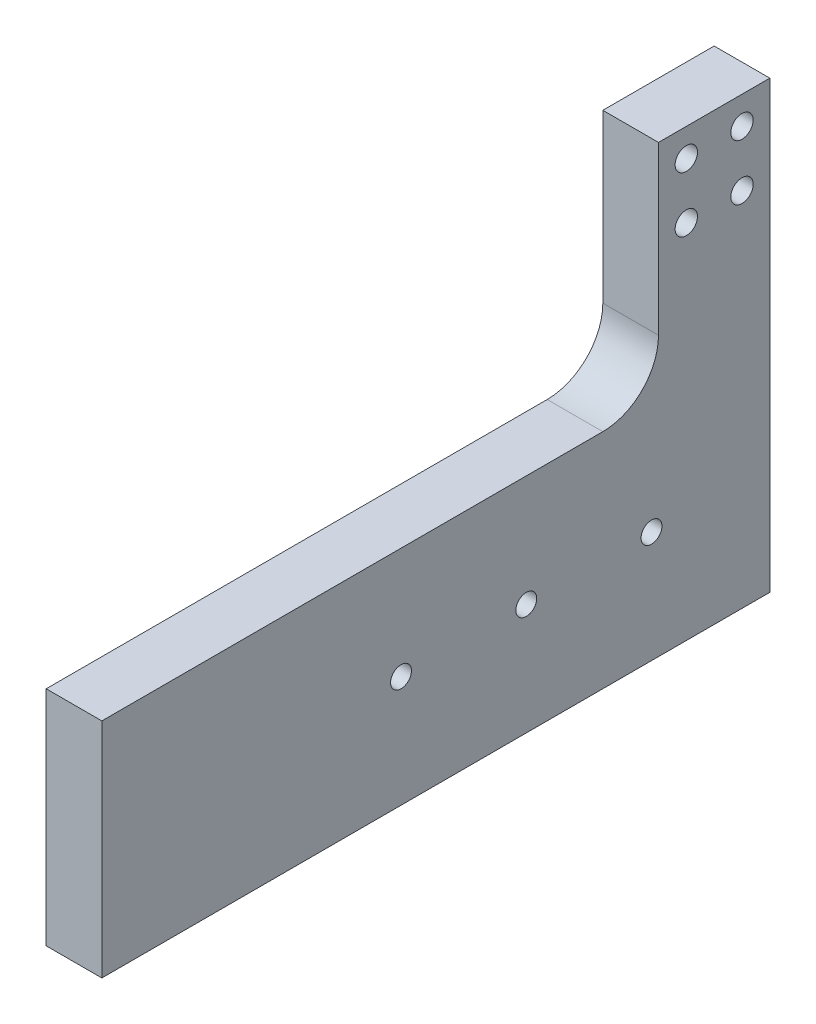
ISO-10303-21;
HEADER;
FILE_DESCRIPTION(('STEP AP214'),'2;1');
FILE_NAME('part.step','',(''),(''),'','','');
FILE_SCHEMA(('AUTOMOTIVE_DESIGN { 1 0 10303 214 1 1 1 1 }'));
ENDSEC;
DATA;
#1=APPLICATION_CONTEXT('core data for automotive mechanical design processes');
#2=APPLICATION_PROTOCOL_DEFINITION('international standard','automotive_design',2000,#1);
#3=PRODUCT_CONTEXT('',#1,'mechanical');
#4=PRODUCT('Part','Part','',(#3));
#5=PRODUCT_RELATED_PRODUCT_CATEGORY('part','',(#4));
#6=PRODUCT_DEFINITION_FORMATION('','',#4);
#7=PRODUCT_DEFINITION_CONTEXT('part definition',#1,'design');
#8=PRODUCT_DEFINITION('design','',#6,#7);
#9=PRODUCT_DEFINITION_SHAPE('','',#8);
#10=(LENGTH_UNIT() NAMED_UNIT(*) SI_UNIT(.MILLI.,.METRE.));
#11=(NAMED_UNIT(*) PLANE_ANGLE_UNIT() SI_UNIT($,.RADIAN.));
#12=(NAMED_UNIT(*) SI_UNIT($,.STERADIAN.) SOLID_ANGLE_UNIT());
#13=UNCERTAINTY_MEASURE_WITH_UNIT(LENGTH_MEASURE(1.E-05),#10,'distance_accuracy_value','');
#14=(GEOMETRIC_REPRESENTATION_CONTEXT(3) GLOBAL_UNCERTAINTY_ASSIGNED_CONTEXT((#13)) GLOBAL_UNIT_ASSIGNED_CONTEXT((#10,
#11,#12)) REPRESENTATION_CONTEXT('',''));
#15=CARTESIAN_POINT('',(0.,0.,0.));
#16=DIRECTION('',(0.,0.,1.));
#17=DIRECTION('',(1.,0.,0.));
#18=AXIS2_PLACEMENT_3D('',#15,#16,#17);
#19=CARTESIAN_POINT('',(12.7,0.,0.));
#20=DIRECTION('',(1.,0.,0.));
#21=DIRECTION('',(0.,0.,-1.));
#22=AXIS2_PLACEMENT_3D('',#19,#20,#21);
#23=PLANE('',#22);
#24=CARTESIAN_POINT('',(12.7,95.25,19.05));
#25=DIRECTION('',(1.,0.,0.));
#26=DIRECTION('',(0.,0.,-1.));
#27=AXIS2_PLACEMENT_3D('',#24,#25,#26);
#28=CIRCLE('',#27,2.55270000000001);
#29=CARTESIAN_POINT('',(12.7,95.25,16.4973));
#30=VERTEX_POINT('',#29);
#31=EDGE_CURVE('E229',#30,#30,#28,.T.);
#32=ORIENTED_EDGE('',*,*,#31,.F.);
#33=EDGE_LOOP('',(#32));
#34=FACE_BOUND('',#33,.T.);
#35=CARTESIAN_POINT('',(12.7,95.25,6.35));
#36=DIRECTION('',(1.,0.,0.));
#37=DIRECTION('',(0.,0.,-1.));
#38=AXIS2_PLACEMENT_3D('',#35,#36,#37);
#39=CIRCLE('',#38,2.55270000000001);
#40=CARTESIAN_POINT('',(12.7,95.25,3.79729999999999));
#41=VERTEX_POINT('',#40);
#42=EDGE_CURVE('E221',#41,#41,#39,.T.);
#43=ORIENTED_EDGE('',*,*,#42,.F.);
#44=EDGE_LOOP('',(#43));
#45=FACE_BOUND('',#44,.T.);
#46=CARTESIAN_POINT('',(12.7,82.55,6.35));
#47=DIRECTION('',(1.,0.,0.));
#48=DIRECTION('',(0.,0.,-1.));
#49=AXIS2_PLACEMENT_3D('',#46,#47,#48);
#50=CIRCLE('',#49,2.55270000000001);
#51=CARTESIAN_POINT('',(12.7,82.55,3.79729999999999));
#52=VERTEX_POINT('',#51);
#53=EDGE_CURVE('E213',#52,#52,#50,.T.);
#54=ORIENTED_EDGE('',*,*,#53,.F.);
#55=EDGE_LOOP('',(#54));
#56=FACE_BOUND('',#55,.T.);
#57=CARTESIAN_POINT('',(12.7,82.55,19.05));
#58=DIRECTION('',(1.,0.,0.));
#59=DIRECTION('',(0.,0.,-1.));
#60=AXIS2_PLACEMENT_3D('',#57,#58,#59);
#61=CIRCLE('',#60,2.55270000000001);
#62=CARTESIAN_POINT('',(12.7,82.55,16.4973));
#63=VERTEX_POINT('',#62);
#64=EDGE_CURVE('E205',#63,#63,#61,.T.);
#65=ORIENTED_EDGE('',*,*,#64,.F.);
#66=EDGE_LOOP('',(#65));
#67=FACE_BOUND('',#66,.T.);
#68=CARTESIAN_POINT('',(12.7,25.4,55.5625));
#69=DIRECTION('',(1.,0.,0.));
#70=DIRECTION('',(0.,0.,-1.));
#71=AXIS2_PLACEMENT_3D('',#68,#69,#70);
#72=CIRCLE('',#71,2.38125000000001);
#73=CARTESIAN_POINT('',(12.7,25.4,53.18125));
#74=VERTEX_POINT('',#73);
#75=EDGE_CURVE('E182',#74,#74,#72,.T.);
#76=ORIENTED_EDGE('',*,*,#75,.F.);
#77=EDGE_LOOP('',(#76));
#78=FACE_BOUND('',#77,.T.);
#79=DIRECTION('',(0.,0.,-1.));
#80=VECTOR('',#79,1.);
#81=CARTESIAN_POINT('',(12.7,0.,152.4));
#82=LINE('',#81,#80);
#83=CARTESIAN_POINT('',(12.7,0.,152.4));
#84=VERTEX_POINT('',#83);
#85=CARTESIAN_POINT('',(12.7,0.,0.));
#86=VERTEX_POINT('',#85);
#87=EDGE_CURVE('E113',#84,#86,#82,.T.);
#88=ORIENTED_EDGE('',*,*,#87,.T.);
#89=DIRECTION('',(0.,1.,0.));
#90=VECTOR('',#89,1.);
#91=CARTESIAN_POINT('',(12.7,0.,0.));
#92=LINE('',#91,#90);
#93=CARTESIAN_POINT('',(12.7,101.6,0.));
#94=VERTEX_POINT('',#93);
#95=EDGE_CURVE('E101',#86,#94,#92,.T.);
#96=ORIENTED_EDGE('',*,*,#95,.T.);
#97=DIRECTION('',(0.,0.,1.));
#98=VECTOR('',#97,1.);
#99=CARTESIAN_POINT('',(12.7,101.6,0.));
#100=LINE('',#99,#98);
#101=CARTESIAN_POINT('',(12.7,101.6,25.4));
#102=VERTEX_POINT('',#101);
#103=EDGE_CURVE('E112',#94,#102,#100,.T.);
#104=ORIENTED_EDGE('',*,*,#103,.T.);
#105=DIRECTION('',(0.,-1.,0.));
#106=VECTOR('',#105,1.);
#107=CARTESIAN_POINT('',(12.7,101.6,25.4));
#108=LINE('',#107,#106);
#109=CARTESIAN_POINT('',(12.7,63.5,25.4));
#110=VERTEX_POINT('',#109);
#111=EDGE_CURVE('E173',#102,#110,#108,.T.);
#112=ORIENTED_EDGE('',*,*,#111,.T.);
#113=CARTESIAN_POINT('',(12.7,63.5,38.1));
#114=DIRECTION('',(1.,0.,0.));
#115=DIRECTION('',(0.,0.,-1.));
#116=AXIS2_PLACEMENT_3D('',#113,#114,#115);
#117=CIRCLE('',#116,12.7);
#118=CARTESIAN_POINT('',(12.7,50.8,38.1));
#119=VERTEX_POINT('',#118);
#120=EDGE_CURVE('E11',#110,#119,#117,.F.);
#121=ORIENTED_EDGE('',*,*,#120,.T.);
#122=DIRECTION('',(0.,0.,1.));
#123=VECTOR('',#122,1.);
#124=CARTESIAN_POINT('',(12.7,50.8,25.4));
#125=LINE('',#124,#123);
#126=CARTESIAN_POINT('',(12.7,50.8,152.4));
#127=VERTEX_POINT('',#126);
#128=EDGE_CURVE('E170',#119,#127,#125,.T.);
#129=ORIENTED_EDGE('',*,*,#128,.T.);
#130=DIRECTION('',(0.,-1.,0.));
#131=VECTOR('',#130,1.);
#132=CARTESIAN_POINT('',(12.7,50.8,152.4));
#133=LINE('',#132,#131);
#134=EDGE_CURVE('E118',#127,#84,#133,.T.);
#135=ORIENTED_EDGE('',*,*,#134,.T.);
#136=EDGE_LOOP('',(#88,#96,#104,#112,#121,#129,#135));
#137=FACE_BOUND('',#136,.T.);
#138=CARTESIAN_POINT('',(12.7,25.4,84.1375));
#139=DIRECTION('',(1.,0.,0.));
#140=DIRECTION('',(0.,0.,-1.));
#141=AXIS2_PLACEMENT_3D('',#138,#139,#140);
#142=CIRCLE('',#141,2.38125000000001);
#143=CARTESIAN_POINT('',(12.7,25.4,81.75625));
#144=VERTEX_POINT('',#143);
#145=EDGE_CURVE('E167',#144,#144,#142,.T.);
#146=ORIENTED_EDGE('',*,*,#145,.F.);
#147=EDGE_LOOP('',(#146));
#148=FACE_BOUND('',#147,.T.);
#149=CARTESIAN_POINT('',(12.7,25.4,26.9875));
#150=DIRECTION('',(1.,0.,0.));
#151=DIRECTION('',(0.,0.,-1.));
#152=AXIS2_PLACEMENT_3D('',#149,#150,#151);
#153=CIRCLE('',#152,2.38125000000001);
#154=CARTESIAN_POINT('',(12.7,25.4,24.60625));
#155=VERTEX_POINT('',#154);
#156=EDGE_CURVE('E190',#155,#155,#153,.T.);
#157=ORIENTED_EDGE('',*,*,#156,.F.);
#158=EDGE_LOOP('',(#157));
#159=FACE_BOUND('',#158,.T.);
#160=ADVANCED_FACE('F41',(#34,#45,#56,#67,#78,#137,#148,#159),#23,.T.);
#161=CARTESIAN_POINT('',(0.,0.,0.));
#162=DIRECTION('',(1.,0.,0.));
#163=DIRECTION('',(0.,0.,-1.));
#164=AXIS2_PLACEMENT_3D('',#161,#162,#163);
#165=PLANE('',#164);
#166=CARTESIAN_POINT('',(0.,95.25,19.05));
#167=DIRECTION('',(1.,0.,0.));
#168=DIRECTION('',(0.,0.,-1.));
#169=AXIS2_PLACEMENT_3D('',#166,#167,#168);
#170=CIRCLE('',#169,2.55269999999999);
#171=CARTESIAN_POINT('',(0.,95.25,16.4973));
#172=VERTEX_POINT('',#171);
#173=EDGE_CURVE('E225',#172,#172,#170,.T.);
#174=ORIENTED_EDGE('',*,*,#173,.T.);
#175=EDGE_LOOP('',(#174));
#176=FACE_BOUND('',#175,.T.);
#177=CARTESIAN_POINT('',(0.,95.25,6.35));
#178=DIRECTION('',(1.,0.,0.));
#179=DIRECTION('',(0.,0.,-1.));
#180=AXIS2_PLACEMENT_3D('',#177,#178,#179);
#181=CIRCLE('',#180,2.55269999999999);
#182=CARTESIAN_POINT('',(0.,95.25,3.79730000000001));
#183=VERTEX_POINT('',#182);
#184=EDGE_CURVE('E217',#183,#183,#181,.T.);
#185=ORIENTED_EDGE('',*,*,#184,.T.);
#186=EDGE_LOOP('',(#185));
#187=FACE_BOUND('',#186,.T.);
#188=CARTESIAN_POINT('',(0.,82.55,6.35));
#189=DIRECTION('',(1.,0.,0.));
#190=DIRECTION('',(0.,0.,-1.));
#191=AXIS2_PLACEMENT_3D('',#188,#189,#190);
#192=CIRCLE('',#191,2.55269999999999);
#193=CARTESIAN_POINT('',(0.,82.55,3.79730000000001));
#194=VERTEX_POINT('',#193);
#195=EDGE_CURVE('E209',#194,#194,#192,.T.);
#196=ORIENTED_EDGE('',*,*,#195,.T.);
#197=EDGE_LOOP('',(#196));
#198=FACE_BOUND('',#197,.T.);
#199=CARTESIAN_POINT('',(0.,82.55,19.05));
#200=DIRECTION('',(1.,0.,0.));
#201=DIRECTION('',(0.,0.,-1.));
#202=AXIS2_PLACEMENT_3D('',#199,#200,#201);
#203=CIRCLE('',#202,2.55269999999999);
#204=CARTESIAN_POINT('',(0.,82.55,16.4973));
#205=VERTEX_POINT('',#204);
#206=EDGE_CURVE('E198',#205,#205,#203,.T.);
#207=ORIENTED_EDGE('',*,*,#206,.T.);
#208=EDGE_LOOP('',(#207));
#209=FACE_BOUND('',#208,.T.);
#210=DIRECTION('',(0.,0.,-1.));
#211=VECTOR('',#210,1.);
#212=CARTESIAN_POINT('',(0.,0.,152.4));
#213=LINE('',#212,#211);
#214=CARTESIAN_POINT('',(0.,0.,152.4));
#215=VERTEX_POINT('',#214);
#216=CARTESIAN_POINT('',(0.,0.,0.));
#217=VERTEX_POINT('',#216);
#218=EDGE_CURVE('E127',#215,#217,#213,.T.);
#219=ORIENTED_EDGE('',*,*,#218,.F.);
#220=DIRECTION('',(0.,-1.,0.));
#221=VECTOR('',#220,1.);
#222=CARTESIAN_POINT('',(0.,50.8,152.4));
#223=LINE('',#222,#221);
#224=CARTESIAN_POINT('',(0.,50.8,152.4));
#225=VERTEX_POINT('',#224);
#226=EDGE_CURVE('E123',#225,#215,#223,.T.);
#227=ORIENTED_EDGE('',*,*,#226,.F.);
#228=DIRECTION('',(0.,0.,1.));
#229=VECTOR('',#228,1.);
#230=CARTESIAN_POINT('',(0.,50.8,25.4));
#231=LINE('',#230,#229);
#232=CARTESIAN_POINT('',(0.,50.8,38.1));
#233=VERTEX_POINT('',#232);
#234=EDGE_CURVE('E153',#233,#225,#231,.T.);
#235=ORIENTED_EDGE('',*,*,#234,.F.);
#236=CARTESIAN_POINT('',(0.,63.5,38.1));
#237=DIRECTION('',(1.,0.,0.));
#238=DIRECTION('',(0.,0.,-1.));
#239=AXIS2_PLACEMENT_3D('',#236,#237,#238);
#240=CIRCLE('',#239,12.7);
#241=CARTESIAN_POINT('',(0.,63.5,25.4));
#242=VERTEX_POINT('',#241);
#243=EDGE_CURVE('E50',#233,#242,#240,.T.);
#244=ORIENTED_EDGE('',*,*,#243,.T.);
#245=DIRECTION('',(0.,-1.,0.));
#246=VECTOR('',#245,1.);
#247=CARTESIAN_POINT('',(0.,101.6,25.4));
#248=LINE('',#247,#246);
#249=CARTESIAN_POINT('',(0.,101.6,25.4));
#250=VERTEX_POINT('',#249);
#251=EDGE_CURVE('E156',#250,#242,#248,.T.);
#252=ORIENTED_EDGE('',*,*,#251,.F.);
#253=DIRECTION('',(0.,0.,1.));
#254=VECTOR('',#253,1.);
#255=CARTESIAN_POINT('',(0.,101.6,0.));
#256=LINE('',#255,#254);
#257=CARTESIAN_POINT('',(0.,101.6,0.));
#258=VERTEX_POINT('',#257);
#259=EDGE_CURVE('E159',#258,#250,#256,.T.);
#260=ORIENTED_EDGE('',*,*,#259,.F.);
#261=DIRECTION('',(0.,1.,0.));
#262=VECTOR('',#261,1.);
#263=CARTESIAN_POINT('',(0.,0.,0.));
#264=LINE('',#263,#262);
#265=EDGE_CURVE('E162',#217,#258,#264,.T.);
#266=ORIENTED_EDGE('',*,*,#265,.F.);
#267=EDGE_LOOP('',(#219,#227,#235,#244,#252,#260,#266));
#268=FACE_BOUND('',#267,.T.);
#269=CARTESIAN_POINT('',(0.,25.4,84.1375));
#270=DIRECTION('',(1.,0.,0.));
#271=DIRECTION('',(0.,0.,-1.));
#272=AXIS2_PLACEMENT_3D('',#269,#270,#271);
#273=CIRCLE('',#272,2.38125000000001);
#274=CARTESIAN_POINT('',(0.,25.4,81.75625));
#275=VERTEX_POINT('',#274);
#276=EDGE_CURVE('E178',#275,#275,#273,.T.);
#277=ORIENTED_EDGE('',*,*,#276,.T.);
#278=EDGE_LOOP('',(#277));
#279=FACE_BOUND('',#278,.T.);
#280=CARTESIAN_POINT('',(0.,25.4,55.5625));
#281=DIRECTION('',(1.,0.,0.));
#282=DIRECTION('',(0.,0.,-1.));
#283=AXIS2_PLACEMENT_3D('',#280,#281,#282);
#284=CIRCLE('',#283,2.38125000000001);
#285=CARTESIAN_POINT('',(0.,25.4,53.18125));
#286=VERTEX_POINT('',#285);
#287=EDGE_CURVE('E186',#286,#286,#284,.T.);
#288=ORIENTED_EDGE('',*,*,#287,.T.);
#289=EDGE_LOOP('',(#288));
#290=FACE_BOUND('',#289,.T.);
#291=CARTESIAN_POINT('',(0.,25.4,26.9875));
#292=DIRECTION('',(1.,0.,0.));
#293=DIRECTION('',(0.,0.,-1.));
#294=AXIS2_PLACEMENT_3D('',#291,#292,#293);
#295=CIRCLE('',#294,2.38125000000001);
#296=CARTESIAN_POINT('',(0.,25.4,24.60625));
#297=VERTEX_POINT('',#296);
#298=EDGE_CURVE('E194',#297,#297,#295,.T.);
#299=ORIENTED_EDGE('',*,*,#298,.T.);
#300=EDGE_LOOP('',(#299));
#301=FACE_BOUND('',#300,.T.);
#302=ADVANCED_FACE('F238',(#176,#187,#198,#209,#268,#279,#290,#301),#165,.F.);
#303=CARTESIAN_POINT('',(12.7,0.,152.4));
#304=DIRECTION('',(0.,1.,0.));
#305=DIRECTION('',(0.,0.,1.));
#306=AXIS2_PLACEMENT_3D('',#303,#304,#305);
#307=PLANE('',#306);
#308=ORIENTED_EDGE('',*,*,#218,.T.);
#309=DIRECTION('',(-1.,0.,0.));
#310=VECTOR('',#309,1.);
#311=CARTESIAN_POINT('',(12.7,0.,0.));
#312=LINE('',#311,#310);
#313=EDGE_CURVE('E105',#86,#217,#312,.T.);
#314=ORIENTED_EDGE('',*,*,#313,.F.);
#315=ORIENTED_EDGE('',*,*,#87,.F.);
#316=DIRECTION('',(-1.,0.,0.));
#317=VECTOR('',#316,1.);
#318=CARTESIAN_POINT('',(12.7,0.,152.4));
#319=LINE('',#318,#317);
#320=EDGE_CURVE('E148',#84,#215,#319,.T.);
#321=ORIENTED_EDGE('',*,*,#320,.T.);
#322=EDGE_LOOP('',(#308,#314,#315,#321));
#323=FACE_BOUND('',#322,.T.);
#324=ADVANCED_FACE('F125',(#323),#307,.F.);
#325=CARTESIAN_POINT('',(12.7,0.,0.));
#326=DIRECTION('',(0.,0.,1.));
#327=DIRECTION('',(1.,0.,0.));
#328=AXIS2_PLACEMENT_3D('',#325,#326,#327);
#329=PLANE('',#328);
#330=ORIENTED_EDGE('',*,*,#265,.T.);
#331=DIRECTION('',(-1.,0.,0.));
#332=VECTOR('',#331,1.);
#333=CARTESIAN_POINT('',(12.7,101.6,0.));
#334=LINE('',#333,#332);
#335=EDGE_CURVE('E108',#94,#258,#334,.T.);
#336=ORIENTED_EDGE('',*,*,#335,.F.);
#337=ORIENTED_EDGE('',*,*,#95,.F.);
#338=ORIENTED_EDGE('',*,*,#313,.T.);
#339=EDGE_LOOP('',(#330,#336,#337,#338));
#340=FACE_BOUND('',#339,.T.);
#341=ADVANCED_FACE('F103',(#340),#329,.F.);
#342=CARTESIAN_POINT('',(12.7,101.6,0.));
#343=DIRECTION('',(0.,-1.,0.));
#344=DIRECTION('',(0.,0.,-1.));
#345=AXIS2_PLACEMENT_3D('',#342,#343,#344);
#346=PLANE('',#345);
#347=ORIENTED_EDGE('',*,*,#259,.T.);
#348=DIRECTION('',(-1.,0.,0.));
#349=VECTOR('',#348,1.);
#350=CARTESIAN_POINT('',(12.7,101.6,25.4));
#351=LINE('',#350,#349);
#352=EDGE_CURVE('E135',#102,#250,#351,.T.);
#353=ORIENTED_EDGE('',*,*,#352,.F.);
#354=ORIENTED_EDGE('',*,*,#103,.F.);
#355=ORIENTED_EDGE('',*,*,#335,.T.);
#356=EDGE_LOOP('',(#347,#353,#354,#355));
#357=FACE_BOUND('',#356,.T.);
#358=ADVANCED_FACE('F288',(#357),#346,.F.);
#359=CARTESIAN_POINT('',(12.7,101.6,25.4));
#360=DIRECTION('',(0.,0.,-1.));
#361=DIRECTION('',(0.,1.,0.));
#362=AXIS2_PLACEMENT_3D('',#359,#360,#361);
#363=PLANE('',#362);
#364=ORIENTED_EDGE('',*,*,#251,.T.);
#365=DIRECTION('',(-1.,0.,0.));
#366=VECTOR('',#365,1.);
#367=CARTESIAN_POINT('',(12.7,63.5,25.4));
#368=LINE('',#367,#366);
#369=EDGE_CURVE('E57',#242,#110,#368,.F.);
#370=ORIENTED_EDGE('',*,*,#369,.T.);
#371=ORIENTED_EDGE('',*,*,#111,.F.);
#372=ORIENTED_EDGE('',*,*,#352,.T.);
#373=EDGE_LOOP('',(#364,#370,#371,#372));
#374=FACE_BOUND('',#373,.T.);
#375=ADVANCED_FACE('F284',(#374),#363,.F.);
#376=CARTESIAN_POINT('',(12.7,50.8,25.4));
#377=DIRECTION('',(0.,-1.,0.));
#378=DIRECTION('',(0.,0.,-1.));
#379=AXIS2_PLACEMENT_3D('',#376,#377,#378);
#380=PLANE('',#379);
#381=ORIENTED_EDGE('',*,*,#128,.F.);
#382=DIRECTION('',(-1.,0.,0.));
#383=VECTOR('',#382,1.);
#384=CARTESIAN_POINT('',(0.,50.8,38.1));
#385=LINE('',#384,#383);
#386=EDGE_CURVE('E129',#119,#233,#385,.T.);
#387=ORIENTED_EDGE('',*,*,#386,.T.);
#388=ORIENTED_EDGE('',*,*,#234,.T.);
#389=DIRECTION('',(-1.,0.,0.));
#390=VECTOR('',#389,1.);
#391=CARTESIAN_POINT('',(12.7,50.8,152.4));
#392=LINE('',#391,#390);
#393=EDGE_CURVE('E144',#127,#225,#392,.T.);
#394=ORIENTED_EDGE('',*,*,#393,.F.);
#395=EDGE_LOOP('',(#381,#387,#388,#394));
#396=FACE_BOUND('',#395,.T.);
#397=ADVANCED_FACE('F280',(#396),#380,.F.);
#398=CARTESIAN_POINT('',(12.7,50.8,152.4));
#399=DIRECTION('',(0.,0.,-1.));
#400=DIRECTION('',(-1.,0.,0.));
#401=AXIS2_PLACEMENT_3D('',#398,#399,#400);
#402=PLANE('',#401);
#403=ORIENTED_EDGE('',*,*,#226,.T.);
#404=ORIENTED_EDGE('',*,*,#320,.F.);
#405=ORIENTED_EDGE('',*,*,#134,.F.);
#406=ORIENTED_EDGE('',*,*,#393,.T.);
#407=EDGE_LOOP('',(#403,#404,#405,#406));
#408=FACE_BOUND('',#407,.T.);
#409=ADVANCED_FACE('F275',(#408),#402,.F.);
#410=CARTESIAN_POINT('',(12.7,25.4,84.1375));
#411=DIRECTION('',(-1.,0.,0.));
#412=DIRECTION('',(0.,0.,1.));
#413=AXIS2_PLACEMENT_3D('',#410,#411,#412);
#414=CYLINDRICAL_SURFACE('',#413,2.38125000000001);
#415=ORIENTED_EDGE('',*,*,#145,.T.);
#416=EDGE_LOOP('',(#415));
#417=FACE_BOUND('',#416,.T.);
#418=ORIENTED_EDGE('',*,*,#276,.F.);
#419=EDGE_LOOP('',(#418));
#420=FACE_BOUND('',#419,.T.);
#421=ADVANCED_FACE('F252',(#417,#420),#414,.F.);
#422=CARTESIAN_POINT('',(12.7,25.4,55.5625));
#423=DIRECTION('',(-1.,0.,0.));
#424=DIRECTION('',(0.,0.,1.));
#425=AXIS2_PLACEMENT_3D('',#422,#423,#424);
#426=CYLINDRICAL_SURFACE('',#425,2.38125000000001);
#427=ORIENTED_EDGE('',*,*,#75,.T.);
#428=EDGE_LOOP('',(#427));
#429=FACE_BOUND('',#428,.T.);
#430=ORIENTED_EDGE('',*,*,#287,.F.);
#431=EDGE_LOOP('',(#430));
#432=FACE_BOUND('',#431,.T.);
#433=ADVANCED_FACE('F248',(#429,#432),#426,.F.);
#434=CARTESIAN_POINT('',(12.7,25.4,26.9875));
#435=DIRECTION('',(-1.,0.,0.));
#436=DIRECTION('',(0.,0.,1.));
#437=AXIS2_PLACEMENT_3D('',#434,#435,#436);
#438=CYLINDRICAL_SURFACE('',#437,2.38125000000001);
#439=ORIENTED_EDGE('',*,*,#156,.T.);
#440=EDGE_LOOP('',(#439));
#441=FACE_BOUND('',#440,.T.);
#442=ORIENTED_EDGE('',*,*,#298,.F.);
#443=EDGE_LOOP('',(#442));
#444=FACE_BOUND('',#443,.T.);
#445=ADVANCED_FACE('F251',(#441,#444),#438,.F.);
#446=CARTESIAN_POINT('',(12.7,82.55,19.05));
#447=DIRECTION('',(1.,0.,0.));
#448=DIRECTION('',(0.,0.,-1.));
#449=AXIS2_PLACEMENT_3D('',#446,#447,#448);
#450=CYLINDRICAL_SURFACE('',#449,2.5527);
#451=ORIENTED_EDGE('',*,*,#206,.F.);
#452=EDGE_LOOP('',(#451));
#453=FACE_BOUND('',#452,.T.);
#454=ORIENTED_EDGE('',*,*,#64,.T.);
#455=EDGE_LOOP('',(#454));
#456=FACE_BOUND('',#455,.T.);
#457=ADVANCED_FACE('F263',(#453,#456),#450,.F.);
#458=CARTESIAN_POINT('',(12.7,82.55,6.35));
#459=DIRECTION('',(1.,0.,0.));
#460=DIRECTION('',(0.,0.,-1.));
#461=AXIS2_PLACEMENT_3D('',#458,#459,#460);
#462=CYLINDRICAL_SURFACE('',#461,2.5527);
#463=ORIENTED_EDGE('',*,*,#195,.F.);
#464=EDGE_LOOP('',(#463));
#465=FACE_BOUND('',#464,.T.);
#466=ORIENTED_EDGE('',*,*,#53,.T.);
#467=EDGE_LOOP('',(#466));
#468=FACE_BOUND('',#467,.T.);
#469=ADVANCED_FACE('F269',(#465,#468),#462,.F.);
#470=CARTESIAN_POINT('',(12.7,95.25,6.35));
#471=DIRECTION('',(1.,0.,0.));
#472=DIRECTION('',(0.,0.,-1.));
#473=AXIS2_PLACEMENT_3D('',#470,#471,#472);
#474=CYLINDRICAL_SURFACE('',#473,2.5527);
#475=ORIENTED_EDGE('',*,*,#184,.F.);
#476=EDGE_LOOP('',(#475));
#477=FACE_BOUND('',#476,.T.);
#478=ORIENTED_EDGE('',*,*,#42,.T.);
#479=EDGE_LOOP('',(#478));
#480=FACE_BOUND('',#479,.T.);
#481=ADVANCED_FACE('F346',(#477,#480),#474,.F.);
#482=CARTESIAN_POINT('',(12.7,95.25,19.05));
#483=DIRECTION('',(1.,0.,0.));
#484=DIRECTION('',(0.,0.,-1.));
#485=AXIS2_PLACEMENT_3D('',#482,#483,#484);
#486=CYLINDRICAL_SURFACE('',#485,2.5527);
#487=ORIENTED_EDGE('',*,*,#173,.F.);
#488=EDGE_LOOP('',(#487));
#489=FACE_BOUND('',#488,.T.);
#490=ORIENTED_EDGE('',*,*,#31,.T.);
#491=EDGE_LOOP('',(#490));
#492=FACE_BOUND('',#491,.T.);
#493=ADVANCED_FACE('F234',(#489,#492),#486,.F.);
#494=CARTESIAN_POINT('',(12.7,63.5,38.1));
#495=DIRECTION('',(1.,0.,0.));
#496=DIRECTION('',(0.,0.,-1.));
#497=AXIS2_PLACEMENT_3D('',#494,#495,#496);
#498=CYLINDRICAL_SURFACE('',#497,12.7);
#499=ORIENTED_EDGE('',*,*,#120,.F.);
#500=ORIENTED_EDGE('',*,*,#369,.F.);
#501=ORIENTED_EDGE('',*,*,#243,.F.);
#502=ORIENTED_EDGE('',*,*,#386,.F.);
#503=EDGE_LOOP('',(#499,#500,#501,#502));
#504=FACE_BOUND('',#503,.T.);
#505=ADVANCED_FACE('F43',(#504),#498,.F.);
#506=CLOSED_SHELL('',(#160,#302,#324,#341,#358,#375,#397,#409,#421,#433,#445,#457,#469,#481,
#493,#505));
#507=MANIFOLD_SOLID_BREP('B2',#506);
#508=ADVANCED_BREP_SHAPE_REPRESENTATION('',(#18,#507),#14);
#509=SHAPE_DEFINITION_REPRESENTATION(#9,#508);
ENDSEC;
END-ISO-10303-21;
